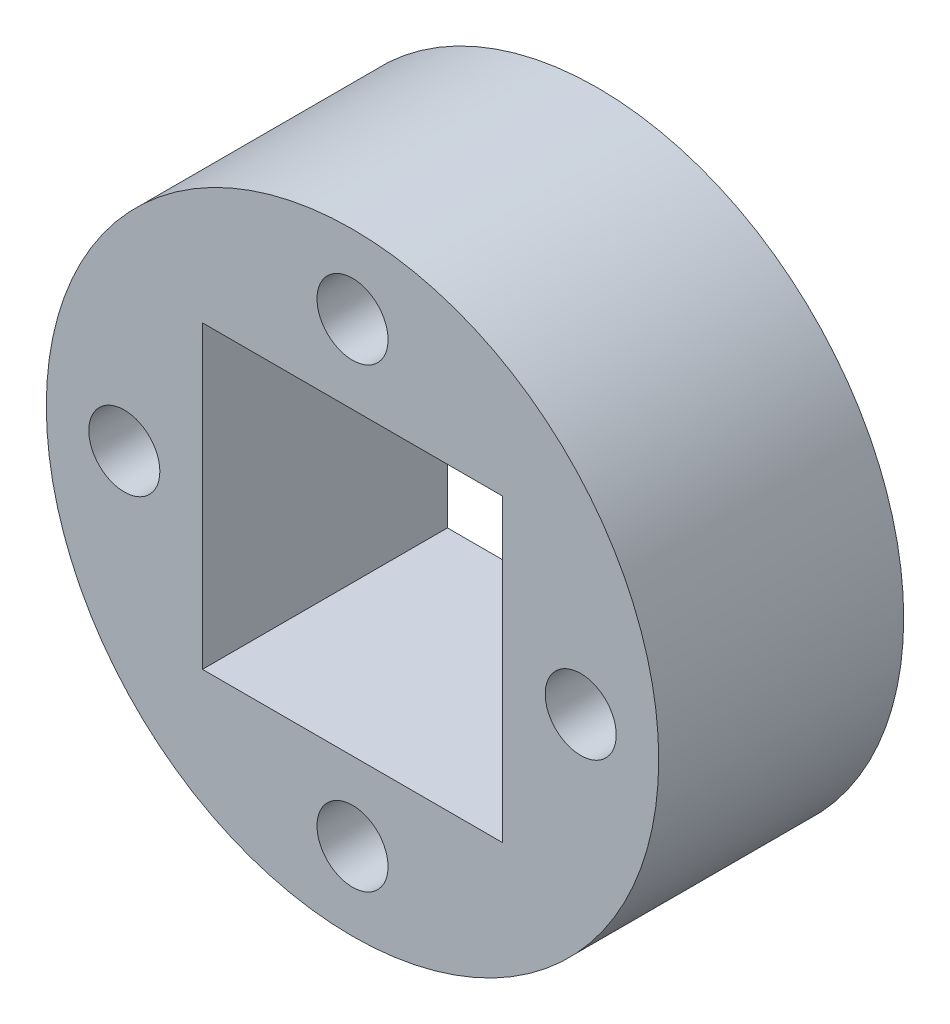
ISO-10303-21;
HEADER;
FILE_DESCRIPTION(('STEP AP214'),'2;1');
FILE_NAME('part.step','',(''),(''),'','','');
FILE_SCHEMA(('AUTOMOTIVE_DESIGN { 1 0 10303 214 1 1 1 1 }'));
ENDSEC;
DATA;
#1=APPLICATION_CONTEXT('core data for automotive mechanical design processes');
#2=APPLICATION_PROTOCOL_DEFINITION('international standard','automotive_design',2000,#1);
#3=PRODUCT_CONTEXT('',#1,'mechanical');
#4=PRODUCT('Part','Part','',(#3));
#5=PRODUCT_RELATED_PRODUCT_CATEGORY('part','',(#4));
#6=PRODUCT_DEFINITION_FORMATION('','',#4);
#7=PRODUCT_DEFINITION_CONTEXT('part definition',#1,'design');
#8=PRODUCT_DEFINITION('design','',#6,#7);
#9=PRODUCT_DEFINITION_SHAPE('','',#8);
#10=(LENGTH_UNIT() NAMED_UNIT(*) SI_UNIT(.MILLI.,.METRE.));
#11=(NAMED_UNIT(*) PLANE_ANGLE_UNIT() SI_UNIT($,.RADIAN.));
#12=(NAMED_UNIT(*) SI_UNIT($,.STERADIAN.) SOLID_ANGLE_UNIT());
#13=UNCERTAINTY_MEASURE_WITH_UNIT(LENGTH_MEASURE(1.E-05),#10,'distance_accuracy_value','');
#14=(GEOMETRIC_REPRESENTATION_CONTEXT(3) GLOBAL_UNCERTAINTY_ASSIGNED_CONTEXT((#13)) GLOBAL_UNIT_ASSIGNED_CONTEXT((#10,
#11,#12)) REPRESENTATION_CONTEXT('',''));
#15=CARTESIAN_POINT('',(0.,0.,0.));
#16=DIRECTION('',(0.,0.,1.));
#17=DIRECTION('',(1.,0.,0.));
#18=AXIS2_PLACEMENT_3D('',#15,#16,#17);
#19=CARTESIAN_POINT('',(0.,0.,5.));
#20=DIRECTION('',(0.,0.,-1.));
#21=DIRECTION('',(-1.,0.,0.));
#22=AXIS2_PLACEMENT_3D('',#19,#20,#21);
#23=CYLINDRICAL_SURFACE('',#22,12.5);
#24=CARTESIAN_POINT('',(0.,0.,5.));
#25=DIRECTION('',(0.,0.,1.));
#26=DIRECTION('',(1.,0.,0.));
#27=AXIS2_PLACEMENT_3D('',#24,#25,#26);
#28=CIRCLE('',#27,12.5);
#29=CARTESIAN_POINT('',(12.5,0.,5.));
#30=VERTEX_POINT('',#29);
#31=EDGE_CURVE('E11',#30,#30,#28,.T.);
#32=ORIENTED_EDGE('',*,*,#31,.F.);
#33=EDGE_LOOP('',(#32));
#34=FACE_BOUND('',#33,.T.);
#35=CARTESIAN_POINT('',(0.,0.,-5.));
#36=DIRECTION('',(0.,0.,1.));
#37=DIRECTION('',(1.,0.,0.));
#38=AXIS2_PLACEMENT_3D('',#35,#36,#37);
#39=CIRCLE('',#38,12.5);
#40=CARTESIAN_POINT('',(12.5,0.,-5.));
#41=VERTEX_POINT('',#40);
#42=EDGE_CURVE('E36',#41,#41,#39,.T.);
#43=ORIENTED_EDGE('',*,*,#42,.T.);
#44=EDGE_LOOP('',(#43));
#45=FACE_BOUND('',#44,.T.);
#46=ADVANCED_FACE('F33',(#34,#45),#23,.T.);
#47=CARTESIAN_POINT('',(0.,0.,5.));
#48=DIRECTION('',(0.,0.,1.));
#49=DIRECTION('',(1.,0.,0.));
#50=AXIS2_PLACEMENT_3D('',#47,#48,#49);
#51=PLANE('',#50);
#52=CARTESIAN_POINT('',(9.315,0.,5.));
#53=DIRECTION('',(0.,0.,1.));
#54=DIRECTION('',(1.,0.,0.));
#55=AXIS2_PLACEMENT_3D('',#52,#53,#54);
#56=CIRCLE('',#55,1.45);
#57=CARTESIAN_POINT('',(10.765,0.,5.));
#58=VERTEX_POINT('',#57);
#59=EDGE_CURVE('E118',#58,#58,#56,.T.);
#60=ORIENTED_EDGE('',*,*,#59,.F.);
#61=EDGE_LOOP('',(#60));
#62=FACE_BOUND('',#61,.T.);
#63=CARTESIAN_POINT('',(0.,-9.315,5.));
#64=DIRECTION('',(0.,0.,1.));
#65=DIRECTION('',(1.,0.,0.));
#66=AXIS2_PLACEMENT_3D('',#63,#64,#65);
#67=CIRCLE('',#66,1.45);
#68=CARTESIAN_POINT('',(1.44999999999997,-9.315,5.));
#69=VERTEX_POINT('',#68);
#70=EDGE_CURVE('E131',#69,#69,#67,.T.);
#71=ORIENTED_EDGE('',*,*,#70,.F.);
#72=EDGE_LOOP('',(#71));
#73=FACE_BOUND('',#72,.T.);
#74=CARTESIAN_POINT('',(-9.315,0.,5.));
#75=DIRECTION('',(0.,0.,1.));
#76=DIRECTION('',(1.,0.,0.));
#77=AXIS2_PLACEMENT_3D('',#74,#75,#76);
#78=CIRCLE('',#77,1.45);
#79=CARTESIAN_POINT('',(-7.865,0.,5.));
#80=VERTEX_POINT('',#79);
#81=EDGE_CURVE('E124',#80,#80,#78,.T.);
#82=ORIENTED_EDGE('',*,*,#81,.F.);
#83=EDGE_LOOP('',(#82));
#84=FACE_BOUND('',#83,.T.);
#85=CARTESIAN_POINT('',(0.,9.315,5.));
#86=DIRECTION('',(0.,0.,1.));
#87=DIRECTION('',(1.,0.,0.));
#88=AXIS2_PLACEMENT_3D('',#85,#86,#87);
#89=CIRCLE('',#88,1.45);
#90=CARTESIAN_POINT('',(1.4500000000001,9.315,5.));
#91=VERTEX_POINT('',#90);
#92=EDGE_CURVE('E125',#91,#91,#89,.T.);
#93=ORIENTED_EDGE('',*,*,#92,.F.);
#94=EDGE_LOOP('',(#93));
#95=FACE_BOUND('',#94,.T.);
#96=DIRECTION('',(0.,1.,0.));
#97=VECTOR('',#96,1.);
#98=CARTESIAN_POINT('',(6.125,6.125,5.));
#99=LINE('',#98,#97);
#100=CARTESIAN_POINT('',(6.125,-6.125,5.));
#101=VERTEX_POINT('',#100);
#102=CARTESIAN_POINT('',(6.125,6.125,5.));
#103=VERTEX_POINT('',#102);
#104=EDGE_CURVE('E47',#101,#103,#99,.T.);
#105=ORIENTED_EDGE('',*,*,#104,.F.);
#106=DIRECTION('',(1.,0.,0.));
#107=VECTOR('',#106,1.);
#108=CARTESIAN_POINT('',(-6.125,-6.125,5.));
#109=LINE('',#108,#107);
#110=CARTESIAN_POINT('',(-6.125,-6.125,5.));
#111=VERTEX_POINT('',#110);
#112=EDGE_CURVE('E81',#111,#101,#109,.T.);
#113=ORIENTED_EDGE('',*,*,#112,.F.);
#114=DIRECTION('',(0.,-1.,0.));
#115=VECTOR('',#114,1.);
#116=CARTESIAN_POINT('',(-6.125,6.125,5.));
#117=LINE('',#116,#115);
#118=CARTESIAN_POINT('',(-6.125,6.125,5.));
#119=VERTEX_POINT('',#118);
#120=EDGE_CURVE('E100',#119,#111,#117,.T.);
#121=ORIENTED_EDGE('',*,*,#120,.F.);
#122=DIRECTION('',(-1.,0.,0.));
#123=VECTOR('',#122,1.);
#124=CARTESIAN_POINT('',(-6.125,6.125,5.));
#125=LINE('',#124,#123);
#126=EDGE_CURVE('E94',#103,#119,#125,.T.);
#127=ORIENTED_EDGE('',*,*,#126,.F.);
#128=EDGE_LOOP('',(#105,#113,#121,#127));
#129=FACE_BOUND('',#128,.T.);
#130=ORIENTED_EDGE('',*,*,#31,.T.);
#131=EDGE_LOOP('',(#130));
#132=FACE_BOUND('',#131,.T.);
#133=ADVANCED_FACE('F112',(#62,#73,#84,#95,#129,#132),#51,.T.);
#134=CARTESIAN_POINT('',(0.,0.,-5.));
#135=DIRECTION('',(0.,0.,1.));
#136=DIRECTION('',(1.,0.,0.));
#137=AXIS2_PLACEMENT_3D('',#134,#135,#136);
#138=PLANE('',#137);
#139=CARTESIAN_POINT('',(9.315,0.,-5.));
#140=DIRECTION('',(0.,0.,1.));
#141=DIRECTION('',(1.,0.,0.));
#142=AXIS2_PLACEMENT_3D('',#139,#140,#141);
#143=CIRCLE('',#142,1.45);
#144=CARTESIAN_POINT('',(10.765,0.,-5.));
#145=VERTEX_POINT('',#144);
#146=EDGE_CURVE('E116',#145,#145,#143,.F.);
#147=ORIENTED_EDGE('',*,*,#146,.F.);
#148=EDGE_LOOP('',(#147));
#149=FACE_BOUND('',#148,.T.);
#150=CARTESIAN_POINT('',(0.,-9.315,-5.));
#151=DIRECTION('',(0.,0.,1.));
#152=DIRECTION('',(1.,0.,0.));
#153=AXIS2_PLACEMENT_3D('',#150,#151,#152);
#154=CIRCLE('',#153,1.45);
#155=CARTESIAN_POINT('',(1.44999999999997,-9.315,-5.));
#156=VERTEX_POINT('',#155);
#157=EDGE_CURVE('E134',#156,#156,#154,.F.);
#158=ORIENTED_EDGE('',*,*,#157,.F.);
#159=EDGE_LOOP('',(#158));
#160=FACE_BOUND('',#159,.T.);
#161=CARTESIAN_POINT('',(-9.315,0.,-5.));
#162=DIRECTION('',(0.,0.,1.));
#163=DIRECTION('',(1.,0.,0.));
#164=AXIS2_PLACEMENT_3D('',#161,#162,#163);
#165=CIRCLE('',#164,1.45);
#166=CARTESIAN_POINT('',(-7.865,0.,-5.));
#167=VERTEX_POINT('',#166);
#168=EDGE_CURVE('E128',#167,#167,#165,.F.);
#169=ORIENTED_EDGE('',*,*,#168,.F.);
#170=EDGE_LOOP('',(#169));
#171=FACE_BOUND('',#170,.T.);
#172=CARTESIAN_POINT('',(0.,9.315,-5.));
#173=DIRECTION('',(0.,0.,1.));
#174=DIRECTION('',(1.,0.,0.));
#175=AXIS2_PLACEMENT_3D('',#172,#173,#174);
#176=CIRCLE('',#175,1.45);
#177=CARTESIAN_POINT('',(1.4500000000001,9.315,-5.));
#178=VERTEX_POINT('',#177);
#179=EDGE_CURVE('E121',#178,#178,#176,.F.);
#180=ORIENTED_EDGE('',*,*,#179,.F.);
#181=EDGE_LOOP('',(#180));
#182=FACE_BOUND('',#181,.T.);
#183=DIRECTION('',(-1.,0.,0.));
#184=VECTOR('',#183,1.);
#185=CARTESIAN_POINT('',(-6.125,-6.125,-5.));
#186=LINE('',#185,#184);
#187=CARTESIAN_POINT('',(6.125,-6.125,-5.));
#188=VERTEX_POINT('',#187);
#189=CARTESIAN_POINT('',(-6.125,-6.125,-5.));
#190=VERTEX_POINT('',#189);
#191=EDGE_CURVE('E92',#188,#190,#186,.T.);
#192=ORIENTED_EDGE('',*,*,#191,.F.);
#193=DIRECTION('',(0.,-1.,0.));
#194=VECTOR('',#193,1.);
#195=CARTESIAN_POINT('',(6.125,6.125,-5.));
#196=LINE('',#195,#194);
#197=CARTESIAN_POINT('',(6.125,6.125,-5.));
#198=VERTEX_POINT('',#197);
#199=EDGE_CURVE('E75',#198,#188,#196,.T.);
#200=ORIENTED_EDGE('',*,*,#199,.F.);
#201=DIRECTION('',(1.,0.,0.));
#202=VECTOR('',#201,1.);
#203=CARTESIAN_POINT('',(-6.125,6.125,-5.));
#204=LINE('',#203,#202);
#205=CARTESIAN_POINT('',(-6.125,6.125,-5.));
#206=VERTEX_POINT('',#205);
#207=EDGE_CURVE('E84',#206,#198,#204,.T.);
#208=ORIENTED_EDGE('',*,*,#207,.F.);
#209=DIRECTION('',(0.,1.,0.));
#210=VECTOR('',#209,1.);
#211=CARTESIAN_POINT('',(-6.125,6.125,-5.));
#212=LINE('',#211,#210);
#213=EDGE_CURVE('E55',#190,#206,#212,.T.);
#214=ORIENTED_EDGE('',*,*,#213,.F.);
#215=EDGE_LOOP('',(#192,#200,#208,#214));
#216=FACE_BOUND('',#215,.T.);
#217=ORIENTED_EDGE('',*,*,#42,.F.);
#218=EDGE_LOOP('',(#217));
#219=FACE_BOUND('',#218,.T.);
#220=ADVANCED_FACE('F89',(#149,#160,#171,#182,#216,#219),#138,.F.);
#221=CARTESIAN_POINT('',(6.125,6.125,-5.001));
#222=DIRECTION('',(1.,0.,0.));
#223=DIRECTION('',(0.,1.,0.));
#224=AXIS2_PLACEMENT_3D('',#221,#222,#223);
#225=PLANE('',#224);
#226=ORIENTED_EDGE('',*,*,#199,.T.);
#227=DIRECTION('',(0.,0.,1.));
#228=VECTOR('',#227,1.);
#229=CARTESIAN_POINT('',(6.125,-6.125,-5.001));
#230=LINE('',#229,#228);
#231=EDGE_CURVE('E87',#188,#101,#230,.T.);
#232=ORIENTED_EDGE('',*,*,#231,.T.);
#233=ORIENTED_EDGE('',*,*,#104,.T.);
#234=DIRECTION('',(0.,0.,1.));
#235=VECTOR('',#234,1.);
#236=CARTESIAN_POINT('',(6.125,6.125,-5.001));
#237=LINE('',#236,#235);
#238=EDGE_CURVE('E71',#198,#103,#237,.T.);
#239=ORIENTED_EDGE('',*,*,#238,.F.);
#240=EDGE_LOOP('',(#226,#232,#233,#239));
#241=FACE_BOUND('',#240,.T.);
#242=ADVANCED_FACE('F73',(#241),#225,.F.);
#243=CARTESIAN_POINT('',(-6.125,-6.125,-5.001));
#244=DIRECTION('',(0.,-1.,0.));
#245=DIRECTION('',(0.,0.,-1.));
#246=AXIS2_PLACEMENT_3D('',#243,#244,#245);
#247=PLANE('',#246);
#248=ORIENTED_EDGE('',*,*,#191,.T.);
#249=DIRECTION('',(0.,0.,1.));
#250=VECTOR('',#249,1.);
#251=CARTESIAN_POINT('',(-6.125,-6.125,-5.001));
#252=LINE('',#251,#250);
#253=EDGE_CURVE('E106',#190,#111,#252,.T.);
#254=ORIENTED_EDGE('',*,*,#253,.T.);
#255=ORIENTED_EDGE('',*,*,#112,.T.);
#256=ORIENTED_EDGE('',*,*,#231,.F.);
#257=EDGE_LOOP('',(#248,#254,#255,#256));
#258=FACE_BOUND('',#257,.T.);
#259=ADVANCED_FACE('F115',(#258),#247,.F.);
#260=CARTESIAN_POINT('',(-6.125,6.125,-5.001));
#261=DIRECTION('',(-1.,0.,0.));
#262=DIRECTION('',(0.,-1.,0.));
#263=AXIS2_PLACEMENT_3D('',#260,#261,#262);
#264=PLANE('',#263);
#265=ORIENTED_EDGE('',*,*,#213,.T.);
#266=DIRECTION('',(0.,0.,1.));
#267=VECTOR('',#266,1.);
#268=CARTESIAN_POINT('',(-6.125,6.125,-5.001));
#269=LINE('',#268,#267);
#270=EDGE_CURVE('E80',#206,#119,#269,.T.);
#271=ORIENTED_EDGE('',*,*,#270,.T.);
#272=ORIENTED_EDGE('',*,*,#120,.T.);
#273=ORIENTED_EDGE('',*,*,#253,.F.);
#274=EDGE_LOOP('',(#265,#271,#272,#273));
#275=FACE_BOUND('',#274,.T.);
#276=ADVANCED_FACE('F108',(#275),#264,.F.);
#277=CARTESIAN_POINT('',(-6.125,6.125,-5.001));
#278=DIRECTION('',(0.,1.,0.));
#279=DIRECTION('',(0.,0.,1.));
#280=AXIS2_PLACEMENT_3D('',#277,#278,#279);
#281=PLANE('',#280);
#282=ORIENTED_EDGE('',*,*,#207,.T.);
#283=ORIENTED_EDGE('',*,*,#238,.T.);
#284=ORIENTED_EDGE('',*,*,#126,.T.);
#285=ORIENTED_EDGE('',*,*,#270,.F.);
#286=EDGE_LOOP('',(#282,#283,#284,#285));
#287=FACE_BOUND('',#286,.T.);
#288=ADVANCED_FACE('F85',(#287),#281,.F.);
#289=CARTESIAN_POINT('',(0.,9.315,-5.001));
#290=DIRECTION('',(0.,0.,1.));
#291=DIRECTION('',(1.,0.,0.));
#292=AXIS2_PLACEMENT_3D('',#289,#290,#291);
#293=CYLINDRICAL_SURFACE('',#292,1.45);
#294=ORIENTED_EDGE('',*,*,#92,.T.);
#295=EDGE_LOOP('',(#294));
#296=FACE_BOUND('',#295,.T.);
#297=ORIENTED_EDGE('',*,*,#179,.T.);
#298=EDGE_LOOP('',(#297));
#299=FACE_BOUND('',#298,.T.);
#300=ADVANCED_FACE('F154',(#296,#299),#293,.F.);
#301=CARTESIAN_POINT('',(-9.315,0.,-5.001));
#302=DIRECTION('',(0.,0.,1.));
#303=DIRECTION('',(1.,0.,0.));
#304=AXIS2_PLACEMENT_3D('',#301,#302,#303);
#305=CYLINDRICAL_SURFACE('',#304,1.45);
#306=ORIENTED_EDGE('',*,*,#81,.T.);
#307=EDGE_LOOP('',(#306));
#308=FACE_BOUND('',#307,.T.);
#309=ORIENTED_EDGE('',*,*,#168,.T.);
#310=EDGE_LOOP('',(#309));
#311=FACE_BOUND('',#310,.T.);
#312=ADVANCED_FACE('F157',(#308,#311),#305,.F.);
#313=CARTESIAN_POINT('',(0.,-9.315,-5.001));
#314=DIRECTION('',(0.,0.,1.));
#315=DIRECTION('',(1.,0.,0.));
#316=AXIS2_PLACEMENT_3D('',#313,#314,#315);
#317=CYLINDRICAL_SURFACE('',#316,1.45);
#318=ORIENTED_EDGE('',*,*,#70,.T.);
#319=EDGE_LOOP('',(#318));
#320=FACE_BOUND('',#319,.T.);
#321=ORIENTED_EDGE('',*,*,#157,.T.);
#322=EDGE_LOOP('',(#321));
#323=FACE_BOUND('',#322,.T.);
#324=ADVANCED_FACE('F207',(#320,#323),#317,.F.);
#325=CARTESIAN_POINT('',(9.315,0.,-5.001));
#326=DIRECTION('',(0.,0.,1.));
#327=DIRECTION('',(1.,0.,0.));
#328=AXIS2_PLACEMENT_3D('',#325,#326,#327);
#329=CYLINDRICAL_SURFACE('',#328,1.45);
#330=ORIENTED_EDGE('',*,*,#59,.T.);
#331=EDGE_LOOP('',(#330));
#332=FACE_BOUND('',#331,.T.);
#333=ORIENTED_EDGE('',*,*,#146,.T.);
#334=EDGE_LOOP('',(#333));
#335=FACE_BOUND('',#334,.T.);
#336=ADVANCED_FACE('F142',(#332,#335),#329,.F.);
#337=CLOSED_SHELL('',(#46,#133,#220,#242,#259,#276,#288,#300,#312,#324,#336));
#338=MANIFOLD_SOLID_BREP('B2',#337);
#339=ADVANCED_BREP_SHAPE_REPRESENTATION('',(#18,#338),#14);
#340=SHAPE_DEFINITION_REPRESENTATION(#9,#339);
ENDSEC;
END-ISO-10303-21;
